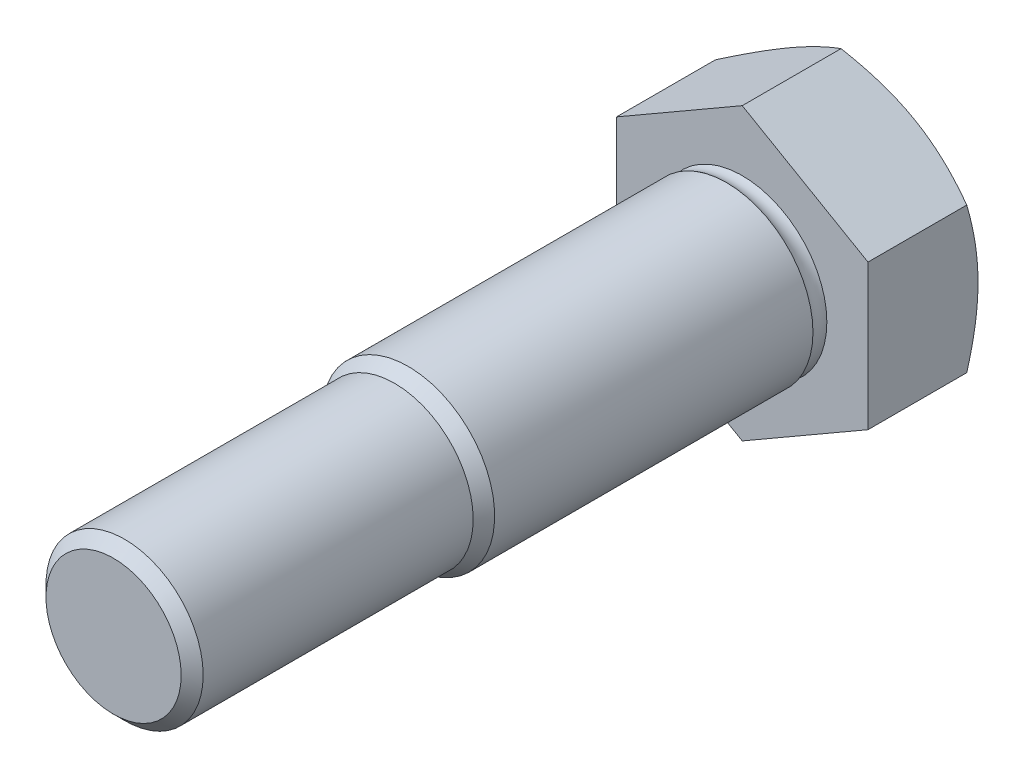
ISO-10303-21;
HEADER;
FILE_DESCRIPTION(('STEP AP214'),'2;1');
FILE_NAME('part.step','',(''),(''),'','','');
FILE_SCHEMA(('AUTOMOTIVE_DESIGN { 1 0 10303 214 1 1 1 1 }'));
ENDSEC;
DATA;
#1=APPLICATION_CONTEXT('core data for automotive mechanical design processes');
#2=APPLICATION_PROTOCOL_DEFINITION('international standard','automotive_design',2000,#1);
#3=PRODUCT_CONTEXT('',#1,'mechanical');
#4=PRODUCT('Part','Part','',(#3));
#5=PRODUCT_RELATED_PRODUCT_CATEGORY('part','',(#4));
#6=PRODUCT_DEFINITION_FORMATION('','',#4);
#7=PRODUCT_DEFINITION_CONTEXT('part definition',#1,'design');
#8=PRODUCT_DEFINITION('design','',#6,#7);
#9=PRODUCT_DEFINITION_SHAPE('','',#8);
#10=(LENGTH_UNIT() NAMED_UNIT(*) SI_UNIT(.MILLI.,.METRE.));
#11=(NAMED_UNIT(*) PLANE_ANGLE_UNIT() SI_UNIT($,.RADIAN.));
#12=(NAMED_UNIT(*) SI_UNIT($,.STERADIAN.) SOLID_ANGLE_UNIT());
#13=UNCERTAINTY_MEASURE_WITH_UNIT(LENGTH_MEASURE(1.E-05),#10,'distance_accuracy_value','');
#14=(GEOMETRIC_REPRESENTATION_CONTEXT(3) GLOBAL_UNCERTAINTY_ASSIGNED_CONTEXT((#13)) GLOBAL_UNIT_ASSIGNED_CONTEXT((#10,
#11,#12)) REPRESENTATION_CONTEXT('',''));
#15=CARTESIAN_POINT('',(0.,0.,0.));
#16=DIRECTION('',(0.,0.,1.));
#17=DIRECTION('',(1.,0.,0.));
#18=AXIS2_PLACEMENT_3D('',#15,#16,#17);
#19=CARTESIAN_POINT('',(0.,0.,44.676349186104));
#20=DIRECTION('',(0.,0.,-1.));
#21=DIRECTION('',(-1.,0.,0.));
#22=AXIS2_PLACEMENT_3D('',#19,#20,#21);
#23=CYLINDRICAL_SURFACE('',#22,5.5);
#24=CARTESIAN_POINT('',(0.,0.,8.));
#25=DIRECTION('',(0.,0.,1.));
#26=DIRECTION('',(1.,0.,0.));
#27=AXIS2_PLACEMENT_3D('',#24,#25,#26);
#28=CIRCLE('',#27,5.5);
#29=CARTESIAN_POINT('',(-5.5,0.,7.99999999999999));
#30=VERTEX_POINT('',#29);
#31=EDGE_CURVE('E262',#30,#30,#28,.T.);
#32=CARTESIAN_POINT('',(0.,0.,28.2539745962155));
#33=DIRECTION('',(0.,0.,1.));
#34=DIRECTION('',(1.,0.,0.));
#35=AXIS2_PLACEMENT_3D('',#32,#33,#34);
#36=CIRCLE('',#35,5.5);
#37=CARTESIAN_POINT('',(-5.5,0.,28.2539745962155));
#38=VERTEX_POINT('',#37);
#39=EDGE_CURVE('E269',#38,#38,#36,.T.);
#40=CARTESIAN_POINT('',(-5.5,0.,7.99999999999999));
#41=CARTESIAN_POINT('',(-5.5,0.,8.21097890204391));
#42=CARTESIAN_POINT('',(-5.5,0.,8.42195780408782));
#43=CARTESIAN_POINT('',(-5.5,0.,8.84391560817564));
#44=CARTESIAN_POINT('',(-5.5,0.,9.05489451021955));
#45=CARTESIAN_POINT('',(-5.5,0.,9.47685231430738));
#46=CARTESIAN_POINT('',(-5.5,0.,9.68783121635129));
#47=CARTESIAN_POINT('',(-5.5,0.,10.1097890204391));
#48=CARTESIAN_POINT('',(-5.5,0.,10.320767922483));
#49=CARTESIAN_POINT('',(-5.5,0.,10.7427257265709));
#50=CARTESIAN_POINT('',(-5.5,0.,10.9537046286148));
#51=CARTESIAN_POINT('',(-5.5,0.,11.3756624327026));
#52=CARTESIAN_POINT('',(-5.5,0.,11.5866413347465));
#53=CARTESIAN_POINT('',(-5.5,0.,12.0085991388343));
#54=CARTESIAN_POINT('',(-5.5,0.,12.2195780408782));
#55=CARTESIAN_POINT('',(-5.5,0.,12.6415358449661));
#56=CARTESIAN_POINT('',(-5.5,0.,12.85251474701));
#57=CARTESIAN_POINT('',(-5.5,0.,13.2744725510978));
#58=CARTESIAN_POINT('',(-5.5,0.,13.4854514531417));
#59=CARTESIAN_POINT('',(-5.5,0.,13.9074092572295));
#60=CARTESIAN_POINT('',(-5.5,0.,14.1183881592734));
#61=CARTESIAN_POINT('',(-5.5,0.,14.5403459633613));
#62=CARTESIAN_POINT('',(-5.5,0.,14.7513248654052));
#63=CARTESIAN_POINT('',(-5.5,0.,15.173282669493));
#64=CARTESIAN_POINT('',(-5.5,0.,15.3842615715369));
#65=CARTESIAN_POINT('',(-5.5,0.,15.8062193756247));
#66=CARTESIAN_POINT('',(-5.5,0.,16.0171982776686));
#67=CARTESIAN_POINT('',(-5.5,0.,16.4391560817565));
#68=CARTESIAN_POINT('',(-5.5,0.,16.6501349838004));
#69=CARTESIAN_POINT('',(-5.5,0.,17.0720927878882));
#70=CARTESIAN_POINT('',(-5.5,0.,17.2830716899321));
#71=CARTESIAN_POINT('',(-5.5,0.,17.7050294940199));
#72=CARTESIAN_POINT('',(-5.5,0.,17.9160083960639));
#73=CARTESIAN_POINT('',(-5.5,0.,18.3379662001517));
#74=CARTESIAN_POINT('',(-5.5,0.,18.5489451021956));
#75=CARTESIAN_POINT('',(-5.5,0.,18.9709029062834));
#76=CARTESIAN_POINT('',(-5.5,0.,19.1818818083273));
#77=CARTESIAN_POINT('',(-5.5,0.,19.6038396124152));
#78=CARTESIAN_POINT('',(-5.5,0.,19.8148185144591));
#79=CARTESIAN_POINT('',(-5.5,0.,20.2367763185469));
#80=CARTESIAN_POINT('',(-5.5,0.,20.4477552205908));
#81=CARTESIAN_POINT('',(-5.5,0.,20.8697130246786));
#82=CARTESIAN_POINT('',(-5.5,0.,21.0806919267225));
#83=CARTESIAN_POINT('',(-5.5,0.,21.5026497308104));
#84=CARTESIAN_POINT('',(-5.5,0.,21.7136286328543));
#85=CARTESIAN_POINT('',(-5.5,0.,22.1355864369421));
#86=CARTESIAN_POINT('',(-5.5,0.,22.346565338986));
#87=CARTESIAN_POINT('',(-5.5,0.,22.7685231430738));
#88=CARTESIAN_POINT('',(-5.5,0.,22.9795020451177));
#89=CARTESIAN_POINT('',(-5.5,0.,23.4014598492056));
#90=CARTESIAN_POINT('',(-5.5,0.,23.6124387512495));
#91=CARTESIAN_POINT('',(-5.5,0.,24.0343965553373));
#92=CARTESIAN_POINT('',(-5.5,0.,24.2453754573812));
#93=CARTESIAN_POINT('',(-5.5,0.,24.667333261469));
#94=CARTESIAN_POINT('',(-5.5,0.,24.878312163513));
#95=CARTESIAN_POINT('',(-5.5,0.,25.3002699676008));
#96=CARTESIAN_POINT('',(-5.5,0.,25.5112488696447));
#97=CARTESIAN_POINT('',(-5.5,0.,25.9332066737325));
#98=CARTESIAN_POINT('',(-5.5,0.,26.1441855757764));
#99=CARTESIAN_POINT('',(-5.5,0.,26.5661433798643));
#100=CARTESIAN_POINT('',(-5.5,0.,26.7771222819082));
#101=CARTESIAN_POINT('',(-5.5,0.,27.199080085996));
#102=CARTESIAN_POINT('',(-5.5,0.,27.4100589880399));
#103=CARTESIAN_POINT('',(-5.5,0.,27.8320167921277));
#104=CARTESIAN_POINT('',(-5.5,0.,28.0429956941716));
#105=CARTESIAN_POINT('',(-5.5,0.,28.2539745962155));
#106=B_SPLINE_CURVE_WITH_KNOTS('',3,(#40,#41,#42,#43,#44,#45,#46,#47,#48,#49,#50,#51,#52,#53,
#54,#55,#56,#57,#58,#59,#60,#61,#62,#63,#64,#65,#66,#67,#68,#69,#70,#71,#72,#73,#74,#75,#76,#77,
#78,#79,#80,#81,#82,#83,#84,#85,#86,#87,#88,#89,#90,#91,#92,#93,#94,#95,#96,#97,#98,#99,#100,
#101,#102,#103,#104,#105),.UNSPECIFIED.,.F.,.F.,(4,2,2,2,2,2,2,2,2,2,2,2,2,2,2,2,2,2,2,2,2,2,2,
2,2,2,2,2,2,2,2,2,4),(0.,0.632936706131737,1.26587341226347,1.89881011839521,2.53174682452695,
3.16468353065868,3.79762023679042,4.43055694292215,5.06349364905389,5.69643035518562,
6.32936706131736,6.96230376744909,7.59524047358083,8.22817717971257,8.8611138858443,
9.49405059197604,10.1269872981078,10.7599240042395,11.3928607103712,12.025797416503,
12.6587341226347,13.2916708287665,13.9246075348982,14.5575442410299,15.1904809471617,
15.8234176532934,16.4563543594251,17.0892910655569,17.7222277716886,18.3551644778203,
18.9881011839521,19.6210378900838,20.2539745962156),.UNSPECIFIED.);
#107=EDGE_CURVE('BSEAM30',#30,#38,#106,.T.);
#108=ORIENTED_EDGE('',*,*,#31,.T.);
#109=ORIENTED_EDGE('',*,*,#39,.F.);
#110=ORIENTED_EDGE('',*,*,#107,.T.);
#111=ORIENTED_EDGE('',*,*,#107,.F.);
#112=EDGE_LOOP('',(#108,#110,#109,#111));
#113=FACE_BOUND('',#112,.T.);
#114=ADVANCED_FACE('F30',(#113),#23,.T.);
#115=CARTESIAN_POINT('',(0.,0.,29.12));
#116=DIRECTION('',(0.,0.,-1.));
#117=DIRECTION('',(-1.,0.,0.));
#118=AXIS2_PLACEMENT_3D('',#115,#116,#117);
#119=CONICAL_SURFACE('',#118,5.,0.523598775598293);
#120=ORIENTED_EDGE('',*,*,#39,.T.);
#121=EDGE_LOOP('',(#120));
#122=FACE_BOUND('',#121,.T.);
#123=CARTESIAN_POINT('',(0.,0.,29.12));
#124=DIRECTION('',(0.,0.,1.));
#125=DIRECTION('',(1.,0.,0.));
#126=AXIS2_PLACEMENT_3D('',#123,#124,#125);
#127=CIRCLE('',#126,5.);
#128=CARTESIAN_POINT('',(5.,0.,29.12));
#129=VERTEX_POINT('',#128);
#130=EDGE_CURVE('E264',#129,#129,#127,.T.);
#131=ORIENTED_EDGE('',*,*,#130,.F.);
#132=EDGE_LOOP('',(#131));
#133=FACE_BOUND('',#132,.T.);
#134=ADVANCED_FACE('F235',(#122,#133),#119,.T.);
#135=CARTESIAN_POINT('',(0.,0.,47.));
#136=DIRECTION('',(0.,0.,1.));
#137=DIRECTION('',(1.,0.,0.));
#138=AXIS2_PLACEMENT_3D('',#135,#136,#137);
#139=PLANE('',#138);
#140=CARTESIAN_POINT('',(0.,0.,47.));
#141=DIRECTION('',(0.,0.,1.));
#142=DIRECTION('',(1.,0.,0.));
#143=AXIS2_PLACEMENT_3D('',#140,#141,#142);
#144=CIRCLE('',#143,4.30000000000001);
#145=CARTESIAN_POINT('',(4.30000000000001,0.,47.));
#146=VERTEX_POINT('',#145);
#147=EDGE_CURVE('E39',#146,#146,#144,.T.);
#148=ORIENTED_EDGE('',*,*,#147,.T.);
#149=EDGE_LOOP('',(#148));
#150=FACE_BOUND('',#149,.T.);
#151=ADVANCED_FACE('F222',(#150),#139,.T.);
#152=CARTESIAN_POINT('',(0.,0.,47.));
#153=DIRECTION('',(0.,0.,-1.));
#154=DIRECTION('',(-1.,0.,0.));
#155=AXIS2_PLACEMENT_3D('',#152,#153,#154);
#156=CONICAL_SURFACE('',#155,4.30000000000001,0.785398163397445);
#157=CARTESIAN_POINT('',(0.,0.,46.3));
#158=DIRECTION('',(0.,0.,1.));
#159=DIRECTION('',(1.,0.,0.));
#160=AXIS2_PLACEMENT_3D('',#157,#158,#159);
#161=CIRCLE('',#160,5.);
#162=CARTESIAN_POINT('',(5.,0.,46.3));
#163=VERTEX_POINT('',#162);
#164=EDGE_CURVE('E11',#163,#163,#161,.F.);
#165=ORIENTED_EDGE('',*,*,#164,.F.);
#166=EDGE_LOOP('',(#165));
#167=FACE_BOUND('',#166,.T.);
#168=ORIENTED_EDGE('',*,*,#147,.F.);
#169=EDGE_LOOP('',(#168));
#170=FACE_BOUND('',#169,.T.);
#171=ADVANCED_FACE('F224',(#167,#170),#156,.T.);
#172=CARTESIAN_POINT('',(0.,0.,47.));
#173=DIRECTION('',(0.,0.,-1.));
#174=DIRECTION('',(-1.,0.,0.));
#175=AXIS2_PLACEMENT_3D('',#172,#173,#174);
#176=CYLINDRICAL_SURFACE('',#175,5.);
#177=ORIENTED_EDGE('',*,*,#130,.T.);
#178=EDGE_LOOP('',(#177));
#179=FACE_BOUND('',#178,.T.);
#180=ORIENTED_EDGE('',*,*,#164,.T.);
#181=EDGE_LOOP('',(#180));
#182=FACE_BOUND('',#181,.T.);
#183=ADVANCED_FACE('F226',(#179,#182),#176,.T.);
#184=CARTESIAN_POINT('',(8.,-4.61880215351701,0.));
#185=DIRECTION('',(0.,0.,1.));
#186=DIRECTION('',(1.,0.,0.));
#187=AXIS2_PLACEMENT_3D('',#184,#185,#186);
#188=PLANE('',#187);
#189=CARTESIAN_POINT('',(0.,0.,0.));
#190=DIRECTION('',(0.,0.,1.));
#191=DIRECTION('',(1.,0.,0.));
#192=AXIS2_PLACEMENT_3D('',#189,#190,#191);
#193=CIRCLE('',#192,7.99999999999998);
#194=CARTESIAN_POINT('',(8.,0.,0.));
#195=VERTEX_POINT('',#194);
#196=CARTESIAN_POINT('',(4.00000000000002,6.9282032302755,0.));
#197=VERTEX_POINT('',#196);
#198=EDGE_CURVE('E106',#195,#197,#193,.T.);
#199=ORIENTED_EDGE('',*,*,#198,.F.);
#200=CARTESIAN_POINT('',(4.00000000000001,-6.9282032302755,0.));
#201=VERTEX_POINT('',#200);
#202=EDGE_CURVE('E120',#201,#195,#193,.T.);
#203=ORIENTED_EDGE('',*,*,#202,.F.);
#204=CARTESIAN_POINT('',(-3.99999999999999,-6.92820323027551,0.));
#205=VERTEX_POINT('',#204);
#206=EDGE_CURVE('E126',#205,#201,#193,.T.);
#207=ORIENTED_EDGE('',*,*,#206,.F.);
#208=CARTESIAN_POINT('',(-8.00000000000001,0.,0.));
#209=VERTEX_POINT('',#208);
#210=EDGE_CURVE('E281',#209,#205,#193,.T.);
#211=ORIENTED_EDGE('',*,*,#210,.F.);
#212=CARTESIAN_POINT('',(0.,0.,0.));
#213=DIRECTION('',(0.,0.,-1.));
#214=DIRECTION('',(-1.,0.,0.));
#215=AXIS2_PLACEMENT_3D('',#212,#213,#214);
#216=CIRCLE('',#215,8.);
#217=CARTESIAN_POINT('',(-3.99999999999999,6.92820323027552,0.));
#218=VERTEX_POINT('',#217);
#219=EDGE_CURVE('E196',#209,#218,#216,.T.);
#220=ORIENTED_EDGE('',*,*,#219,.T.);
#221=EDGE_CURVE('E131',#197,#218,#193,.T.);
#222=ORIENTED_EDGE('',*,*,#221,.F.);
#223=EDGE_LOOP('',(#199,#203,#207,#211,#220,#222));
#224=FACE_BOUND('',#223,.T.);
#225=ADVANCED_FACE('F129',(#224),#188,.F.);
#226=CARTESIAN_POINT('',(0.,0.,0.));
#227=DIRECTION('',(0.,0.,1.));
#228=DIRECTION('',(1.,0.,0.));
#229=AXIS2_PLACEMENT_3D('',#226,#227,#228);
#230=CONICAL_SURFACE('',#229,8.,1.0471975511966);
#231=CARTESIAN_POINT('',(-8.,-12.6403241833434,4.01789851784307));
#232=CARTESIAN_POINT('',(-8.,-12.2888429890866,3.84647214639297));
#233=CARTESIAN_POINT('',(-8.,-11.9365795347971,3.6766233934378));
#234=CARTESIAN_POINT('',(-8.,-11.2300728594024,3.34096411570284));
#235=CARTESIAN_POINT('',(-8.,-10.8758293564386,3.17515418482526));
#236=CARTESIAN_POINT('',(-8.,-10.1632322009988,2.84767085157219));
#237=CARTESIAN_POINT('',(-8.,-9.80486679345537,2.68602294332731));
#238=CARTESIAN_POINT('',(-8.,-9.08536584086789,2.36903857257059));
#239=CARTESIAN_POINT('',(-8.,-8.72423042113801,2.21370182652321));
#240=CARTESIAN_POINT('',(-8.,-7.98618086757373,1.90581142731112));
#241=CARTESIAN_POINT('',(-8.,-7.60915018490751,1.753535670684));
#242=CARTESIAN_POINT('',(-8.,-6.85076602340427,1.45995337106734));
#243=CARTESIAN_POINT('',(-8.,-6.46941207785118,1.31864802555922));
#244=CARTESIAN_POINT('',(-8.,-5.70241101632928,1.05054563337359));
#245=CARTESIAN_POINT('',(-8.,-5.31677359268766,0.923721145933589));
#246=CARTESIAN_POINT('',(-8.,-4.53998543836164,0.688493264105625));
#247=CARTESIAN_POINT('',(-8.,-4.14883641023643,0.580084310552481));
#248=CARTESIAN_POINT('',(-8.,-3.36291309371654,0.38731624749844));
#249=CARTESIAN_POINT('',(-8.,-2.96817310524606,0.302820974454305));
#250=CARTESIAN_POINT('',(-8.,-2.37228929934171,0.197556855991653));
#251=CARTESIAN_POINT('',(-8.,-2.1730197130932,0.166047305895439));
#252=CARTESIAN_POINT('',(-8.,-1.77341268345332,0.110799302302909));
#253=CARTESIAN_POINT('',(-8.,-1.57307534588495,0.0870600927388268));
#254=CARTESIAN_POINT('',(-8.,-1.17432003024232,0.0481362144368751));
#255=CARTESIAN_POINT('',(-8.,-0.975913034515719,0.0328395247829307));
#256=CARTESIAN_POINT('',(-8.,-0.578629157865873,0.0106588581960358));
#257=CARTESIAN_POINT('',(-8.,-0.379752285177633,0.00377473490533657));
#258=CARTESIAN_POINT('',(-8.,0.0181162150089501,-0.00141546612455449));
#259=CARTESIAN_POINT('',(-8.,0.21710784301677,0.00027849451787561));
#260=CARTESIAN_POINT('',(-8.,0.614837468786353,0.0122006755463413));
#261=CARTESIAN_POINT('',(-8.,0.813575454801469,0.0224292777804934));
#262=CARTESIAN_POINT('',(-8.,1.28422958627987,0.056537195023943));
#263=CARTESIAN_POINT('',(-8.,1.55588666308064,0.0840774147759026));
#264=CARTESIAN_POINT('',(-8.,2.09732304369345,0.153653648455693));
#265=CARTESIAN_POINT('',(-8.,2.36710211351335,0.195691436873365));
#266=CARTESIAN_POINT('',(-8.,3.1732284673641,0.341333232790544));
#267=CARTESIAN_POINT('',(-8.,3.70610588911143,0.464444296799986));
#268=CARTESIAN_POINT('',(-8.,4.50338682227295,0.679733886019491));
#269=CARTESIAN_POINT('',(-8.,4.7718730082674,0.757678325488107));
#270=CARTESIAN_POINT('',(-8.,5.30624231268928,0.922110347210553));
#271=CARTESIAN_POINT('',(-8.,5.57212541058543,1.00859799678747));
#272=CARTESIAN_POINT('',(-8.,6.10136687832056,1.1886919855941));
#273=CARTESIAN_POINT('',(-8.,6.36472591087365,1.28229639520746));
#274=CARTESIAN_POINT('',(-8.,6.88922945996468,1.47547803240338));
#275=CARTESIAN_POINT('',(-8.,7.15037403059553,1.5750551136083));
#276=CARTESIAN_POINT('',(-8.,7.86355536188809,1.85485522871919));
#277=CARTESIAN_POINT('',(-8.,8.31360308459799,2.04014375249857));
#278=CARTESIAN_POINT('',(-8.,9.20895545948565,2.42188767730525));
#279=CARTESIAN_POINT('',(-8.,9.65425954009885,2.61834440632378));
#280=CARTESIAN_POINT('',(-8.,10.541236340582,3.0197367485906));
#281=CARTESIAN_POINT('',(-8.,10.9829074987087,3.22467580105595));
#282=CARTESIAN_POINT('',(-8.,11.8631821273786,3.64096812735072));
#283=CARTESIAN_POINT('',(-8.,12.3017857316924,3.85232111930628));
#284=CARTESIAN_POINT('',(-8.,13.177281429533,4.28038318141344));
#285=CARTESIAN_POINT('',(-8.,13.6141693975596,4.49710067110504));
#286=CARTESIAN_POINT('',(-8.,14.4859595755013,4.9344964715129));
#287=CARTESIAN_POINT('',(-8.,14.9208617674874,5.15517481790223));
#288=CARTESIAN_POINT('',(-8.,15.7889376444029,5.59965094163214));
#289=CARTESIAN_POINT('',(-8.,16.2221117130533,5.82344797046283));
#290=CARTESIAN_POINT('',(-8.,17.0871185676234,6.27362076813181));
#291=CARTESIAN_POINT('',(-8.,17.5189513481033,6.49999654741129));
#292=CARTESIAN_POINT('',(-8.,18.7191295779796,7.13289881626218));
#293=CARTESIAN_POINT('',(-8.,19.4862640194244,7.54172124153192));
#294=CARTESIAN_POINT('',(-8.,21.0179839380858,8.36422301189391));
#295=CARTESIAN_POINT('',(-8.,21.7825692437129,8.77790267579175));
#296=CARTESIAN_POINT('',(-8.,23.3071112200699,9.60742602218003));
#297=CARTESIAN_POINT('',(-8.,24.0670747349003,10.0232571342857));
#298=CARTESIAN_POINT('',(-8.,25.2058550741705,10.6490470989963));
#299=CARTESIAN_POINT('',(-8.,25.5852388074708,10.8579756805347));
#300=CARTESIAN_POINT('',(-8.,26.3436690578957,11.2764429633006));
#301=CARTESIAN_POINT('',(-8.,26.7227155754333,11.4859816637799));
#302=CARTESIAN_POINT('',(-8.,27.101614270296,11.6957873913853));
#303=B_SPLINE_CURVE_WITH_KNOTS('',3,(#231,#232,#233,#234,#235,#236,#237,#238,#239,#240,#241,
#242,#243,#244,#245,#246,#247,#248,#249,#250,#251,#252,#253,#254,#255,#256,#257,#258,#259,#260,
#261,#262,#263,#264,#265,#266,#267,#268,#269,#270,#271,#272,#273,#274,#275,#276,#277,#278,#279,
#280,#281,#282,#283,#284,#285,#286,#287,#288,#289,#290,#291,#292,#293,#294,#295,#296,#297,#298,
#299,#300,#301,#302),.UNSPECIFIED.,.F.,.F.,(4,2,2,2,2,2,2,2,2,2,2,2,2,2,2,2,2,2,2,2,2,2,2,2,2,2,
2,2,2,2,2,2,2,2,2,4),(0.,1.1731859787337,2.34654344362964,3.52590216218918,4.70520783810919,
5.92493599017793,7.1447970957138,8.36230683142862,9.57944837731922,10.7895133418803,
11.3946221179473,11.999671998354,12.5964878477067,13.193293313799,13.7901014502291,
14.3869362898641,15.2056272335913,16.0244184199664,17.6627769162718,18.5014144517381,
19.3400585964502,20.1784761591639,21.0168731824131,22.4767387549655,23.9367782820917,
25.3974157055603,26.8579890309847,28.3210217326113,29.784067617513,31.2467682084832,
32.7094747239385,35.317258670726,37.9252147473841,40.5240797476638,41.8234055238152,
43.122729706963),.UNSPECIFIED.);
#304=CARTESIAN_POINT('',(-8.,-4.618802153517,0.714531179816343));
#305=VERTEX_POINT('',#304);
#306=EDGE_CURVE('E176',#305,#209,#303,.T.);
#307=ORIENTED_EDGE('',*,*,#306,.T.);
#308=ORIENTED_EDGE('',*,*,#210,.T.);
#309=CARTESIAN_POINT('',(0.000200000000000077,-9.23771977708785,0.714597847732984));
#310=CARTESIAN_POINT('',(-0.175648783879896,-9.13619343437812,0.655990714047308));
#311=CARTESIAN_POINT('',(-0.352153194306135,-9.03428856550538,0.600043401047301));
#312=CARTESIAN_POINT('',(-0.70659546287846,-8.82965122633296,0.494201005024677));
#313=CARTESIAN_POINT('',(-0.884533904692712,-8.72691841905232,0.444308534431078));
#314=CARTESIAN_POINT('',(-1.42119823762264,-8.41707512197076,0.304692797206879));
#315=CARTESIAN_POINT('',(-1.78204258223572,-8.20874154247284,0.225281170978382));
#316=CARTESIAN_POINT('',(-2.32203917020405,-7.89697436704785,0.132161646294503));
#317=CARTESIAN_POINT('',(-2.49957818964328,-7.79447216638294,0.105634581029138));
#318=CARTESIAN_POINT('',(-2.8554591129602,-7.58900421950647,0.0611531748588905));
#319=CARTESIAN_POINT('',(-3.03380094449324,-7.4860385150631,0.0431980765145951));
#320=CARTESIAN_POINT('',(-3.39079168482359,-7.27992981503516,0.0163156484918807));
#321=CARTESIAN_POINT('',(-3.5694400136095,-7.17678715432034,0.00737807354624917));
#322=CARTESIAN_POINT('',(-3.92690170509738,-6.97040655051484,-0.00127769603485374));
#323=CARTESIAN_POINT('',(-4.10571506253006,-6.86716861046638,-0.000996175497133727));
#324=CARTESIAN_POINT('',(-4.4400133670169,-6.67416139438127,0.00814502526879227));
#325=CARTESIAN_POINT('',(-4.59552190433867,-6.58437849849726,0.0158896043673865));
#326=CARTESIAN_POINT('',(-4.90617476174051,-6.40502298765178,0.0382011348534454));
#327=CARTESIAN_POINT('',(-5.06131905656,-6.31545038727451,0.0527685461381647));
#328=CARTESIAN_POINT('',(-5.52615131589482,-6.04707935721953,0.106360690527553));
#329=CARTESIAN_POINT('',(-5.83501648718172,-5.86875596743374,0.155268641669161));
#330=CARTESIAN_POINT('',(-6.4560232287603,-5.51021755801477,0.277539403234331));
#331=CARTESIAN_POINT('',(-6.76808554211448,-5.3300482973958,0.351420520376017));
#332=CARTESIAN_POINT('',(-7.38755648169476,-4.97239658367398,0.51910014125499));
#333=CARTESIAN_POINT('',(-7.69497304089175,-4.79490955046824,0.612859260854474));
#334=CARTESIAN_POINT('',(-8.0002,-4.61868668346317,0.714597847732994));
#335=B_SPLINE_CURVE_WITH_KNOTS('',3,(#309,#310,#311,#312,#313,#314,#315,#316,#317,#318,#319,
#320,#321,#322,#323,#324,#325,#326,#327,#328,#329,#330,#331,#332,#333,#334),.UNSPECIFIED.,.F.,
.F.,(4,2,2,2,2,2,2,2,2,2,2,2,4),(0.,0.63397354372135,1.26821965714356,2.53934712434766,
3.15934343977049,3.77928496069784,4.39852133866766,5.01773858515595,5.55680239410248,
6.09590254421147,7.17487077411835,8.27776850154293,9.37850115249054),.UNSPECIFIED.);
#336=EDGE_CURVE('E183',#205,#305,#335,.T.);
#337=ORIENTED_EDGE('',*,*,#336,.T.);
#338=EDGE_LOOP('',(#307,#308,#337));
#339=FACE_BOUND('',#338,.T.);
#340=ADVANCED_FACE('F280',(#339),#230,.T.);
#341=CARTESIAN_POINT('',(-8.0002,4.61868668346317,0.714597847732995));
#342=CARTESIAN_POINT('',(-7.8243512161201,4.7202130261729,0.655990714047321));
#343=CARTESIAN_POINT('',(-7.64784680569386,4.82211789504564,0.600043401047313));
#344=CARTESIAN_POINT('',(-7.29340453712154,5.02675523421805,0.494201005024689));
#345=CARTESIAN_POINT('',(-7.11546609530729,5.1294880414987,0.444308534431088));
#346=CARTESIAN_POINT('',(-6.57880176237736,5.43933133858026,0.304692797206887));
#347=CARTESIAN_POINT('',(-6.21795741776428,5.64766491807818,0.225281170978389));
#348=CARTESIAN_POINT('',(-5.67796082979595,5.95943209350317,0.132161646294509));
#349=CARTESIAN_POINT('',(-5.50042181035672,6.06193429416807,0.105634581029144));
#350=CARTESIAN_POINT('',(-5.1445408870398,6.26740224104455,0.0611531748588948));
#351=CARTESIAN_POINT('',(-4.96619905550676,6.37036794548792,0.0431980765145985));
#352=CARTESIAN_POINT('',(-4.60920831517641,6.57647664551585,0.0163156484918829));
#353=CARTESIAN_POINT('',(-4.4305599863905,6.67961930623067,0.00737807354625095));
#354=CARTESIAN_POINT('',(-4.07309829490262,6.88599991003618,-0.00127769603485273));
#355=CARTESIAN_POINT('',(-3.89428493746994,6.98923785008464,-0.000996175497133064));
#356=CARTESIAN_POINT('',(-3.5599866329831,7.18224506616975,0.0081450252687919));
#357=CARTESIAN_POINT('',(-3.40447809566133,7.27202796205376,0.0158896043673855));
#358=CARTESIAN_POINT('',(-3.09382523825949,7.45138347289924,0.0382011348534431));
#359=CARTESIAN_POINT('',(-2.93868094344,7.5409560732765,0.0527685461381618));
#360=CARTESIAN_POINT('',(-2.47384868410518,7.80932710333148,0.106360690527549));
#361=CARTESIAN_POINT('',(-2.16498351281828,7.98765049311728,0.155268641669157));
#362=CARTESIAN_POINT('',(-1.5439767712397,8.34618890253624,0.277539403234325));
#363=CARTESIAN_POINT('',(-1.23191445788552,8.52635816315521,0.35142052037601));
#364=CARTESIAN_POINT('',(-0.612443518305237,8.88400987687704,0.519100141254981));
#365=CARTESIAN_POINT('',(-0.305026959108244,9.06149691008277,0.612859260854464));
#366=CARTESIAN_POINT('',(0.000200000000006737,9.23771977708785,0.714597847732984));
#367=B_SPLINE_CURVE_WITH_KNOTS('',3,(#341,#342,#343,#344,#345,#346,#347,#348,#349,#350,#351,
#352,#353,#354,#355,#356,#357,#358,#359,#360,#361,#362,#363,#364,#365,#366),.UNSPECIFIED.,.F.,
.F.,(4,2,2,2,2,2,2,2,2,2,2,2,4),(0.,0.633973543721349,1.26821965714356,2.53934712434765,
3.15934343977049,3.77928496069783,4.39852133866765,5.01773858515595,5.55680239410248,
6.09590254421147,7.17487077411835,8.27776850154292,9.37850115249055),.UNSPECIFIED.);
#368=CARTESIAN_POINT('',(-8.,4.61880215351701,0.714531179816344));
#369=VERTEX_POINT('',#368);
#370=EDGE_CURVE('E54',#369,#218,#367,.T.);
#371=ORIENTED_EDGE('',*,*,#370,.T.);
#372=ORIENTED_EDGE('',*,*,#219,.F.);
#373=EDGE_CURVE('E135',#209,#369,#303,.T.);
#374=ORIENTED_EDGE('',*,*,#373,.T.);
#375=EDGE_LOOP('',(#371,#372,#374));
#376=FACE_BOUND('',#375,.T.);
#377=ADVANCED_FACE('F195',(#376),#230,.T.);
#378=CARTESIAN_POINT('',(-0.00019999999999281,9.23771977708785,0.714597847732985));
#379=CARTESIAN_POINT('',(0.175648783879904,9.13619343437813,0.65599071404731));
#380=CARTESIAN_POINT('',(0.352153194306142,9.03428856550538,0.600043401047302));
#381=CARTESIAN_POINT('',(0.706595462878467,8.82965122633297,0.494201005024678));
#382=CARTESIAN_POINT('',(0.884533904692719,8.72691841905233,0.444308534431078));
#383=CARTESIAN_POINT('',(1.42119823762265,8.41707512197076,0.304692797206877));
#384=CARTESIAN_POINT('',(1.78204258223573,8.20874154247285,0.22528117097838));
#385=CARTESIAN_POINT('',(2.32203917020406,7.89697436704785,0.1321616462945));
#386=CARTESIAN_POINT('',(2.49957818964329,7.79447216638295,0.105634581029135));
#387=CARTESIAN_POINT('',(2.8554591129602,7.58900421950647,0.0611531748588863));
#388=CARTESIAN_POINT('',(3.03380094449324,7.4860385150631,0.0431980765145907));
#389=CARTESIAN_POINT('',(3.3907916848236,7.27992981503517,0.0163156484918754));
#390=CARTESIAN_POINT('',(3.56944001360951,7.17678715432035,0.00737807354624322));
#391=CARTESIAN_POINT('',(3.92690170509739,6.97040655051484,-0.00127769603486088));
#392=CARTESIAN_POINT('',(4.10571506253007,6.86716861046638,-0.000996175497141465));
#393=CARTESIAN_POINT('',(4.44001336701691,6.67416139438127,0.0081450252687841));
#394=CARTESIAN_POINT('',(4.59552190433868,6.58437849849726,0.0158896043673784));
#395=CARTESIAN_POINT('',(4.90617476174051,6.40502298765178,0.0382011348534362));
#396=CARTESIAN_POINT('',(5.06131905656,6.31545038727452,0.0527685461381545));
#397=CARTESIAN_POINT('',(5.52615131589482,6.04707935721954,0.106360690527541));
#398=CARTESIAN_POINT('',(5.83501648718172,5.86875596743375,0.155268641669148));
#399=CARTESIAN_POINT('',(6.4560232287603,5.51021755801478,0.277539403234316));
#400=CARTESIAN_POINT('',(6.76808554211448,5.33004829739581,0.351420520376));
#401=CARTESIAN_POINT('',(7.38755648169476,4.97239658367398,0.51910014125497));
#402=CARTESIAN_POINT('',(7.69497304089175,4.79490955046825,0.612859260854452));
#403=CARTESIAN_POINT('',(8.0002,4.61868668346317,0.714597847732972));
#404=B_SPLINE_CURVE_WITH_KNOTS('',3,(#378,#379,#380,#381,#382,#383,#384,#385,#386,#387,#388,
#389,#390,#391,#392,#393,#394,#395,#396,#397,#398,#399,#400,#401,#402,#403),.UNSPECIFIED.,.F.,
.F.,(4,2,2,2,2,2,2,2,2,2,2,2,4),(0.,0.63397354372135,1.26821965714356,2.53934712434766,
3.15934343977049,3.77928496069784,4.39852133866766,5.01773858515595,5.55680239410248,
6.09590254421147,7.17487077411834,8.27776850154292,9.37850115249053),.UNSPECIFIED.);
#405=CARTESIAN_POINT('',(0.,9.23760430703402,0.714531179816334));
#406=VERTEX_POINT('',#405);
#407=EDGE_CURVE('E46',#406,#197,#404,.T.);
#408=ORIENTED_EDGE('',*,*,#407,.T.);
#409=ORIENTED_EDGE('',*,*,#221,.T.);
#410=EDGE_CURVE('E114',#218,#406,#367,.T.);
#411=ORIENTED_EDGE('',*,*,#410,.T.);
#412=EDGE_LOOP('',(#408,#409,#411));
#413=FACE_BOUND('',#412,.T.);
#414=ADVANCED_FACE('F152',(#413),#230,.T.);
#415=CARTESIAN_POINT('',(8.,4.61880215351701,0.71453117981632));
#416=VERTEX_POINT('',#415);
#417=EDGE_CURVE('E109',#197,#416,#404,.T.);
#418=ORIENTED_EDGE('',*,*,#417,.T.);
#419=CARTESIAN_POINT('',(8.,-12.6403241960332,4.01789852403381));
#420=CARTESIAN_POINT('',(8.,-12.288843001349,3.84647215232605));
#421=CARTESIAN_POINT('',(8.,-11.9365795466318,3.67662339911335));
#422=CARTESIAN_POINT('',(8.,-11.2300728703803,3.34096412086459));
#423=CARTESIAN_POINT('',(8.,-10.8758293669874,3.17515418973073));
#424=CARTESIAN_POINT('',(8.,-10.1632322106833,2.847670855965));
#425=CARTESIAN_POINT('',(8.,-9.80486680270439,2.68602294746379));
#426=CARTESIAN_POINT('',(8.,-9.08536584924318,2.36903857619859));
#427=CARTESIAN_POINT('',(8.,-8.72423042907499,2.21370182989907));
#428=CARTESIAN_POINT('',(8.,-7.98618087459867,1.90581143017457));
#429=CARTESIAN_POINT('',(8.,-7.60915019145841,1.75353567328779));
#430=CARTESIAN_POINT('',(8.,-6.85076602899959,1.45995337316545));
#431=CARTESIAN_POINT('',(8.,-6.46941208296496,1.31864802741133));
#432=CARTESIAN_POINT('',(8.,-5.70241102047108,1.05054563475681));
#433=CARTESIAN_POINT('',(8.,-5.31677359633906,0.923721147093873));
#434=CARTESIAN_POINT('',(8.,-4.53998544101907,0.68849326485576));
#435=CARTESIAN_POINT('',(8.,-4.1488364123903,0.580084311115386));
#436=CARTESIAN_POINT('',(8.,-3.36291309460872,0.387316247682896));
#437=CARTESIAN_POINT('',(8.,-2.96817310537659,0.302820974461519));
#438=CARTESIAN_POINT('',(8.,-2.372289298316,0.19755685581836));
#439=CARTESIAN_POINT('',(8.,-2.17301971167992,0.166047305676219));
#440=CARTESIAN_POINT('',(8.,-1.77341268126146,0.110799302023637));
#441=CARTESIAN_POINT('',(8.,-1.57307534330209,0.0870600924454216));
#442=CARTESIAN_POINT('',(8.,-1.1743200268856,0.0481362141498924));
#443=CARTESIAN_POINT('',(8.,-0.975913030776188,0.0328395245158568));
#444=CARTESIAN_POINT('',(8.,-0.578629153361276,0.0106588580027817));
#445=CARTESIAN_POINT('',(8.,-0.379752280290785,0.00377473476599284));
#446=CARTESIAN_POINT('',(8.,0.0181162206575766,-0.00141546612270051));
#447=CARTESIAN_POINT('',(8.,0.217107849044923,0.000278494607022037));
#448=CARTESIAN_POINT('',(8.,0.614837475568708,0.0122006758412075));
#449=CARTESIAN_POINT('',(8.,0.813575461958501,0.0224292781937898));
#450=CARTESIAN_POINT('',(8.,1.28422959400839,0.056537195728321));
#451=CARTESIAN_POINT('',(8.,1.55588667100439,0.0840774156472937));
#452=CARTESIAN_POINT('',(8.,2.0973230519986,0.153653649669939));
#453=CARTESIAN_POINT('',(8.,2.36710212200467,0.195691438263454));
#454=CARTESIAN_POINT('',(8.,3.1732284764035,0.341333234711692));
#455=CARTESIAN_POINT('',(8.,3.70610589850139,0.464444299079656));
#456=CARTESIAN_POINT('',(8.,4.50338683218715,0.67973388882777));
#457=CARTESIAN_POINT('',(8.,4.77187301836022,0.757678328473786));
#458=CARTESIAN_POINT('',(8.,5.30624232313726,0.922110350545403));
#459=CARTESIAN_POINT('',(8.,5.57212542120995,1.00859800029409));
#460=CARTESIAN_POINT('',(8.,6.10136688929673,1.1886919894379));
#461=CARTESIAN_POINT('',(8.,6.36472592202497,1.28229639921665));
#462=CARTESIAN_POINT('',(8.,6.88922947146629,1.47547803673738));
#463=CARTESIAN_POINT('',(8.,7.15037404227231,1.57505511810173));
#464=CARTESIAN_POINT('',(8.,7.86355537366012,1.85485523349089));
#465=CARTESIAN_POINT('',(8.,8.31360309629563,2.04014375737067));
#466=CARTESIAN_POINT('',(8.,9.20895547104424,2.4218876823484));
#467=CARTESIAN_POINT('',(8.,9.65425955159278,2.61834441143758));
#468=CARTESIAN_POINT('',(8.,10.5412363519535,3.01973675382426));
#469=CARTESIAN_POINT('',(8.,10.9829075100225,3.2246758063388));
#470=CARTESIAN_POINT('',(8.,11.8631821385832,3.64096813271695));
#471=CARTESIAN_POINT('',(8.,12.3017857428455,3.8523211247067));
#472=CARTESIAN_POINT('',(8.,13.1772814405846,4.28038318686974));
#473=CARTESIAN_POINT('',(8.,13.6141694085611,4.49710067658296));
#474=CARTESIAN_POINT('',(8.,14.4859595864064,4.93449647702592));
#475=CARTESIAN_POINT('',(8.,14.9208617783462,5.15517482342873));
#476=CARTESIAN_POINT('',(8.,15.7889376551723,5.59965094717975));
#477=CARTESIAN_POINT('',(8.,16.2221117237798,5.82344797601809));
#478=CARTESIAN_POINT('',(8.,17.0871185782663,6.27362077369771));
#479=CARTESIAN_POINT('',(8.,17.5189513587056,6.49999655298018));
#480=CARTESIAN_POINT('',(8.,18.71912958854,7.13289882187071));
#481=CARTESIAN_POINT('',(7.99999999999999,19.4862640299852,7.5417212471738));
#482=CARTESIAN_POINT('',(7.99999999999999,21.0179839486505,8.36422301759574));
#483=CARTESIAN_POINT('',(7.99999999999999,21.782569254281,8.77790268152018));
#484=CARTESIAN_POINT('',(7.99999999999999,23.3071112306593,9.60742602796351));
#485=CARTESIAN_POINT('',(7.99999999999999,24.0670747455074,10.0232571400977));
#486=CARTESIAN_POINT('',(7.99999999999999,25.2058550848056,10.6490471048489));
#487=CARTESIAN_POINT('',(7.99999999999999,25.5852388181154,10.8579756864004));
#488=CARTESIAN_POINT('',(7.99999999999999,26.34366906856,11.2764429691921));
#489=CARTESIAN_POINT('',(7.99999999999999,26.7227155861075,11.4859816696839));
#490=CARTESIAN_POINT('',(7.99999999999999,27.1016142809804,11.6957873973015));
#491=B_SPLINE_CURVE_WITH_KNOTS('',3,(#419,#420,#421,#422,#423,#424,#425,#426,#427,#428,#429,
#430,#431,#432,#433,#434,#435,#436,#437,#438,#439,#440,#441,#442,#443,#444,#445,#446,#447,#448,
#449,#450,#451,#452,#453,#454,#455,#456,#457,#458,#459,#460,#461,#462,#463,#464,#465,#466,#467,
#468,#469,#470,#471,#472,#473,#474,#475,#476,#477,#478,#479,#480,#481,#482,#483,#484,#485,#486,
#487,#488,#489,#490),.UNSPECIFIED.,.F.,.F.,(4,2,2,2,2,2,2,2,2,2,2,2,2,2,2,2,2,2,2,2,2,2,2,2,2,2,
2,2,2,2,2,2,2,2,2,4),(0.,1.17318598022513,2.3465434466127,3.52590216667917,4.70520784410598,
5.92493599778493,7.14479710493153,8.36230684225201,9.57944838974702,10.789513356648,
11.3946221338842,11.9996720154598,12.5964878659519,13.1932933331835,13.7901014707533,
14.3869363115282,15.2056272558883,16.0244184428964,17.6627769404704,18.5014144766,
19.3400586219754,20.1784761853505,21.0168732092613,22.4767387817232,23.936778308758,
25.3974157321319,26.857989057462,28.3210217589829,29.7840676437789,31.2467682346453,
32.7094747499967,35.3172586968324,37.9252147735377,40.5240797739051,41.8234055501008,
43.122729733293),.UNSPECIFIED.);
#492=EDGE_CURVE('E102',#416,#195,#491,.F.);
#493=ORIENTED_EDGE('',*,*,#492,.T.);
#494=ORIENTED_EDGE('',*,*,#198,.T.);
#495=EDGE_LOOP('',(#418,#493,#494));
#496=FACE_BOUND('',#495,.T.);
#497=ADVANCED_FACE('F104',(#496),#230,.T.);
#498=CARTESIAN_POINT('',(8.0002,-4.61868668346317,0.714597847732972));
#499=CARTESIAN_POINT('',(7.8243512161201,-4.7202130261729,0.655990714047297));
#500=CARTESIAN_POINT('',(7.64784680569387,-4.82211789504564,0.60004340104729));
#501=CARTESIAN_POINT('',(7.29340453712154,-5.02675523421805,0.494201005024667));
#502=CARTESIAN_POINT('',(7.11546609530729,-5.1294880414987,0.444308534431068));
#503=CARTESIAN_POINT('',(6.57880176237736,-5.43933133858026,0.304692797206869));
#504=CARTESIAN_POINT('',(6.21795741776427,-5.64766491807818,0.225281170978373));
#505=CARTESIAN_POINT('',(5.67796082979595,-5.95943209350317,0.132161646294493));
#506=CARTESIAN_POINT('',(5.50042181035671,-6.06193429416808,0.105634581029128));
#507=CARTESIAN_POINT('',(5.1445408870398,-6.26740224104455,0.0611531748588805));
#508=CARTESIAN_POINT('',(4.96619905550676,-6.37036794548792,0.0431980765145854));
#509=CARTESIAN_POINT('',(4.6092083151764,-6.57647664551586,0.0163156484918711));
#510=CARTESIAN_POINT('',(4.4305599863905,-6.67961930623068,0.00737807354623942));
#511=CARTESIAN_POINT('',(4.07309829490261,-6.88599991003618,-0.00127769603486339));
#512=CARTESIAN_POINT('',(3.89428493746993,-6.98923785008464,-0.000996175497143133));
#513=CARTESIAN_POINT('',(3.55998663298309,-7.18224506616975,0.00814502526878276));
#514=CARTESIAN_POINT('',(3.40447809566133,-7.27202796205376,0.0158896043673767));
#515=CARTESIAN_POINT('',(3.09382523825949,-7.45138347289924,0.0382011348534353));
#516=CARTESIAN_POINT('',(2.93868094344,-7.54095607327651,0.0527685461381546));
#517=CARTESIAN_POINT('',(2.47384868410518,-7.80932710333148,0.106360690527543));
#518=CARTESIAN_POINT('',(2.16498351281828,-7.98765049311728,0.155268641669152));
#519=CARTESIAN_POINT('',(1.5439767712397,-8.34618890253624,0.277539403234321));
#520=CARTESIAN_POINT('',(1.23191445788552,-8.52635816315521,0.351420520376006));
#521=CARTESIAN_POINT('',(0.612443518305241,-8.88400987687704,0.519100141254978));
#522=CARTESIAN_POINT('',(0.305026959108249,-9.06149691008277,0.612859260854462));
#523=CARTESIAN_POINT('',(-0.000200000000000159,-9.23771977708785,0.714597847732982));
#524=B_SPLINE_CURVE_WITH_KNOTS('',3,(#498,#499,#500,#501,#502,#503,#504,#505,#506,#507,#508,
#509,#510,#511,#512,#513,#514,#515,#516,#517,#518,#519,#520,#521,#522,#523),.UNSPECIFIED.,.F.,
.F.,(4,2,2,2,2,2,2,2,2,2,2,2,4),(0.,0.633973543721351,1.26821965714356,2.53934712434766,
3.15934343977049,3.77928496069784,4.39852133866766,5.01773858515595,5.55680239410249,
6.09590254421147,7.17487077411834,8.27776850154292,9.37850115249054),.UNSPECIFIED.);
#525=CARTESIAN_POINT('',(0.,-9.23760430703401,0.714531179816332));
#526=VERTEX_POINT('',#525);
#527=EDGE_CURVE('E181',#201,#526,#524,.T.);
#528=ORIENTED_EDGE('',*,*,#527,.T.);
#529=EDGE_CURVE('E182',#526,#205,#335,.T.);
#530=ORIENTED_EDGE('',*,*,#529,.T.);
#531=ORIENTED_EDGE('',*,*,#206,.T.);
#532=EDGE_LOOP('',(#528,#530,#531));
#533=FACE_BOUND('',#532,.T.);
#534=ADVANCED_FACE('F274',(#533),#230,.T.);
#535=CARTESIAN_POINT('',(8.,-4.61880215351701,0.714531179816321));
#536=VERTEX_POINT('',#535);
#537=EDGE_CURVE('E115',#195,#536,#491,.F.);
#538=ORIENTED_EDGE('',*,*,#537,.T.);
#539=EDGE_CURVE('E123',#536,#201,#524,.T.);
#540=ORIENTED_EDGE('',*,*,#539,.T.);
#541=ORIENTED_EDGE('',*,*,#202,.T.);
#542=EDGE_LOOP('',(#538,#540,#541));
#543=FACE_BOUND('',#542,.T.);
#544=ADVANCED_FACE('F121',(#543),#230,.T.);
#545=CARTESIAN_POINT('',(-8.,-4.618802153517,7.));
#546=DIRECTION('',(0.5,0.866025403784438,0.));
#547=DIRECTION('',(-0.866025403784439,0.5,0.));
#548=AXIS2_PLACEMENT_3D('',#545,#546,#547);
#549=PLANE('',#548);
#550=ORIENTED_EDGE('',*,*,#529,.F.);
#551=DIRECTION('',(0.,0.,-1.));
#552=VECTOR('',#551,1.);
#553=CARTESIAN_POINT('',(0.,-9.23760430703401,7.));
#554=LINE('',#553,#552);
#555=CARTESIAN_POINT('',(0.,-9.23760430703401,7.));
#556=VERTEX_POINT('',#555);
#557=EDGE_CURVE('E214',#556,#526,#554,.T.);
#558=ORIENTED_EDGE('',*,*,#557,.F.);
#559=DIRECTION('',(0.866025403784438,-0.5,0.));
#560=VECTOR('',#559,1.);
#561=CARTESIAN_POINT('',(-8.,-4.618802153517,7.));
#562=LINE('',#561,#560);
#563=CARTESIAN_POINT('',(-8.,-4.618802153517,7.));
#564=VERTEX_POINT('',#563);
#565=EDGE_CURVE('E279',#564,#556,#562,.T.);
#566=ORIENTED_EDGE('',*,*,#565,.F.);
#567=DIRECTION('',(0.,0.,-1.));
#568=VECTOR('',#567,1.);
#569=CARTESIAN_POINT('',(-8.,-4.618802153517,7.));
#570=LINE('',#569,#568);
#571=EDGE_CURVE('E209',#564,#305,#570,.T.);
#572=ORIENTED_EDGE('',*,*,#571,.T.);
#573=ORIENTED_EDGE('',*,*,#336,.F.);
#574=EDGE_LOOP('',(#550,#558,#566,#572,#573));
#575=FACE_BOUND('',#574,.T.);
#576=ADVANCED_FACE('F171',(#575),#549,.F.);
#577=CARTESIAN_POINT('',(-8.,4.61880215351701,7.));
#578=DIRECTION('',(1.,0.,0.));
#579=DIRECTION('',(0.,0.,-1.));
#580=AXIS2_PLACEMENT_3D('',#577,#578,#579);
#581=PLANE('',#580);
#582=ORIENTED_EDGE('',*,*,#306,.F.);
#583=ORIENTED_EDGE('',*,*,#571,.F.);
#584=DIRECTION('',(0.,-1.,0.));
#585=VECTOR('',#584,1.);
#586=CARTESIAN_POINT('',(-8.,4.61880215351701,7.));
#587=LINE('',#586,#585);
#588=CARTESIAN_POINT('',(-8.,4.61880215351701,7.));
#589=VERTEX_POINT('',#588);
#590=EDGE_CURVE('E207',#589,#564,#587,.T.);
#591=ORIENTED_EDGE('',*,*,#590,.F.);
#592=DIRECTION('',(0.,0.,-1.));
#593=VECTOR('',#592,1.);
#594=CARTESIAN_POINT('',(-8.,4.61880215351701,7.));
#595=LINE('',#594,#593);
#596=EDGE_CURVE('E203',#589,#369,#595,.T.);
#597=ORIENTED_EDGE('',*,*,#596,.T.);
#598=ORIENTED_EDGE('',*,*,#373,.F.);
#599=EDGE_LOOP('',(#582,#583,#591,#597,#598));
#600=FACE_BOUND('',#599,.T.);
#601=ADVANCED_FACE('F166',(#600),#581,.F.);
#602=CARTESIAN_POINT('',(0.,9.23760430703402,7.));
#603=DIRECTION('',(0.5,-0.866025403784439,0.));
#604=DIRECTION('',(0.866025403784439,0.5,0.));
#605=AXIS2_PLACEMENT_3D('',#602,#603,#604);
#606=PLANE('',#605);
#607=ORIENTED_EDGE('',*,*,#370,.F.);
#608=ORIENTED_EDGE('',*,*,#596,.F.);
#609=DIRECTION('',(-0.866025403784439,-0.5,0.));
#610=VECTOR('',#609,1.);
#611=CARTESIAN_POINT('',(0.,9.23760430703402,7.));
#612=LINE('',#611,#610);
#613=CARTESIAN_POINT('',(0.,9.23760430703402,7.));
#614=VERTEX_POINT('',#613);
#615=EDGE_CURVE('E285',#614,#589,#612,.T.);
#616=ORIENTED_EDGE('',*,*,#615,.F.);
#617=DIRECTION('',(0.,0.,-1.));
#618=VECTOR('',#617,1.);
#619=CARTESIAN_POINT('',(0.,9.23760430703402,7.));
#620=LINE('',#619,#618);
#621=EDGE_CURVE('E208',#614,#406,#620,.T.);
#622=ORIENTED_EDGE('',*,*,#621,.T.);
#623=ORIENTED_EDGE('',*,*,#410,.F.);
#624=EDGE_LOOP('',(#607,#608,#616,#622,#623));
#625=FACE_BOUND('',#624,.T.);
#626=ADVANCED_FACE('F161',(#625),#606,.F.);
#627=CARTESIAN_POINT('',(8.,4.61880215351701,7.));
#628=DIRECTION('',(-0.5,-0.866025403784439,0.));
#629=DIRECTION('',(0.866025403784439,-0.5,0.));
#630=AXIS2_PLACEMENT_3D('',#627,#628,#629);
#631=PLANE('',#630);
#632=ORIENTED_EDGE('',*,*,#407,.F.);
#633=ORIENTED_EDGE('',*,*,#621,.F.);
#634=DIRECTION('',(-0.866025403784439,0.5,0.));
#635=VECTOR('',#634,1.);
#636=CARTESIAN_POINT('',(8.,4.61880215351701,7.));
#637=LINE('',#636,#635);
#638=CARTESIAN_POINT('',(8.,4.61880215351701,7.));
#639=VERTEX_POINT('',#638);
#640=EDGE_CURVE('E286',#639,#614,#637,.T.);
#641=ORIENTED_EDGE('',*,*,#640,.F.);
#642=DIRECTION('',(0.,0.,-1.));
#643=VECTOR('',#642,1.);
#644=CARTESIAN_POINT('',(8.,4.61880215351701,7.));
#645=LINE('',#644,#643);
#646=EDGE_CURVE('E211',#639,#416,#645,.T.);
#647=ORIENTED_EDGE('',*,*,#646,.T.);
#648=ORIENTED_EDGE('',*,*,#417,.F.);
#649=EDGE_LOOP('',(#632,#633,#641,#647,#648));
#650=FACE_BOUND('',#649,.T.);
#651=ADVANCED_FACE('F158',(#650),#631,.F.);
#652=CARTESIAN_POINT('',(8.,-4.61880215351701,7.));
#653=DIRECTION('',(-1.,0.,0.));
#654=DIRECTION('',(0.,-1.,0.));
#655=AXIS2_PLACEMENT_3D('',#652,#653,#654);
#656=PLANE('',#655);
#657=ORIENTED_EDGE('',*,*,#492,.F.);
#658=ORIENTED_EDGE('',*,*,#646,.F.);
#659=DIRECTION('',(0.,1.,0.));
#660=VECTOR('',#659,1.);
#661=CARTESIAN_POINT('',(8.,-4.61880215351701,7.));
#662=LINE('',#661,#660);
#663=CARTESIAN_POINT('',(8.,-4.61880215351701,7.));
#664=VERTEX_POINT('',#663);
#665=EDGE_CURVE('E289',#664,#639,#662,.T.);
#666=ORIENTED_EDGE('',*,*,#665,.F.);
#667=DIRECTION('',(0.,0.,-1.));
#668=VECTOR('',#667,1.);
#669=CARTESIAN_POINT('',(8.,-4.61880215351701,7.));
#670=LINE('',#669,#668);
#671=EDGE_CURVE('E127',#664,#536,#670,.T.);
#672=ORIENTED_EDGE('',*,*,#671,.T.);
#673=ORIENTED_EDGE('',*,*,#537,.F.);
#674=EDGE_LOOP('',(#657,#658,#666,#672,#673));
#675=FACE_BOUND('',#674,.T.);
#676=ADVANCED_FACE('F133',(#675),#656,.F.);
#677=CARTESIAN_POINT('',(0.,-9.23760430703401,7.));
#678=DIRECTION('',(-0.5,0.866025403784439,0.));
#679=DIRECTION('',(-0.866025403784439,-0.5,0.));
#680=AXIS2_PLACEMENT_3D('',#677,#678,#679);
#681=PLANE('',#680);
#682=ORIENTED_EDGE('',*,*,#539,.F.);
#683=ORIENTED_EDGE('',*,*,#671,.F.);
#684=DIRECTION('',(0.866025403784439,0.5,0.));
#685=VECTOR('',#684,1.);
#686=CARTESIAN_POINT('',(0.,-9.23760430703401,7.));
#687=LINE('',#686,#685);
#688=EDGE_CURVE('E284',#556,#664,#687,.T.);
#689=ORIENTED_EDGE('',*,*,#688,.F.);
#690=ORIENTED_EDGE('',*,*,#557,.T.);
#691=ORIENTED_EDGE('',*,*,#527,.F.);
#692=EDGE_LOOP('',(#682,#683,#689,#690,#691));
#693=FACE_BOUND('',#692,.T.);
#694=ADVANCED_FACE('F32',(#693),#681,.F.);
#695=CARTESIAN_POINT('',(8.,-4.61880215351701,7.));
#696=DIRECTION('',(0.,0.,1.));
#697=DIRECTION('',(1.,0.,0.));
#698=AXIS2_PLACEMENT_3D('',#695,#696,#697);
#699=PLANE('',#698);
#700=ORIENTED_EDGE('',*,*,#688,.T.);
#701=ORIENTED_EDGE('',*,*,#665,.T.);
#702=ORIENTED_EDGE('',*,*,#640,.T.);
#703=ORIENTED_EDGE('',*,*,#615,.T.);
#704=ORIENTED_EDGE('',*,*,#590,.T.);
#705=ORIENTED_EDGE('',*,*,#565,.T.);
#706=EDGE_LOOP('',(#700,#701,#702,#703,#704,#705));
#707=FACE_BOUND('',#706,.T.);
#708=CARTESIAN_POINT('',(0.,0.,7.));
#709=DIRECTION('',(0.,0.,1.));
#710=DIRECTION('',(1.,0.,0.));
#711=AXIS2_PLACEMENT_3D('',#708,#709,#710);
#712=CIRCLE('',#711,5.38348486100883);
#713=CARTESIAN_POINT('',(5.38348486100883,0.,7.));
#714=VERTEX_POINT('',#713);
#715=EDGE_CURVE('E260',#714,#714,#712,.T.);
#716=ORIENTED_EDGE('',*,*,#715,.F.);
#717=EDGE_LOOP('',(#716));
#718=FACE_BOUND('',#717,.T.);
#719=ADVANCED_FACE('F251',(#707,#718),#699,.T.);
#720=CARTESIAN_POINT('',(0.,0.,7.4));
#721=DIRECTION('',(0.,0.,1.));
#722=DIRECTION('',(1.,0.,0.));
#723=AXIS2_PLACEMENT_3D('',#720,#721,#722);
#724=TOROIDAL_SURFACE('',#723,6.3,1.);
#725=ORIENTED_EDGE('',*,*,#715,.T.);
#726=EDGE_LOOP('',(#725));
#727=FACE_BOUND('',#726,.T.);
#728=ORIENTED_EDGE('',*,*,#31,.F.);
#729=EDGE_LOOP('',(#728));
#730=FACE_BOUND('',#729,.T.);
#731=ADVANCED_FACE('F249',(#727,#730),#724,.F.);
#732=CLOSED_SHELL('',(#114,#134,#151,#171,#183,#225,#340,#377,#414,#497,#534,#544,#576,#601,
#626,#651,#676,#694,#719,#731));
#733=MANIFOLD_SOLID_BREP('B2',#732);
#734=ADVANCED_BREP_SHAPE_REPRESENTATION('',(#18,#733),#14);
#735=SHAPE_DEFINITION_REPRESENTATION(#9,#734);
ENDSEC;
END-ISO-10303-21;
